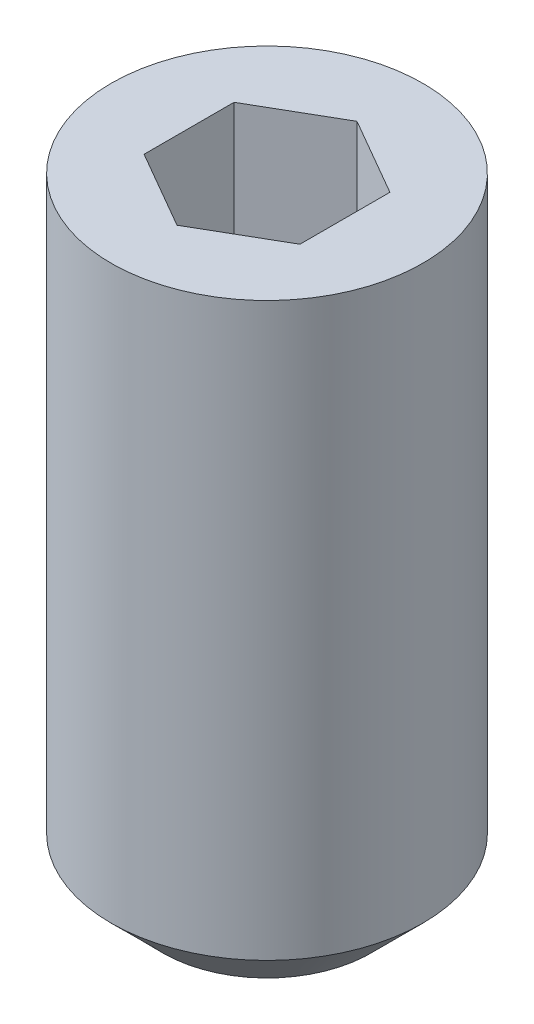
ISO-10303-21;
HEADER;
FILE_DESCRIPTION(('STEP AP214'),'2;1');
FILE_NAME('part.step','',(''),(''),'','','');
FILE_SCHEMA(('AUTOMOTIVE_DESIGN { 1 0 10303 214 1 1 1 1 }'));
ENDSEC;
DATA;
#1=APPLICATION_CONTEXT('core data for automotive mechanical design processes');
#2=APPLICATION_PROTOCOL_DEFINITION('international standard','automotive_design',2000,#1);
#3=PRODUCT_CONTEXT('',#1,'mechanical');
#4=PRODUCT('Part','Part','',(#3));
#5=PRODUCT_RELATED_PRODUCT_CATEGORY('part','',(#4));
#6=PRODUCT_DEFINITION_FORMATION('','',#4);
#7=PRODUCT_DEFINITION_CONTEXT('part definition',#1,'design');
#8=PRODUCT_DEFINITION('design','',#6,#7);
#9=PRODUCT_DEFINITION_SHAPE('','',#8);
#10=(LENGTH_UNIT() NAMED_UNIT(*) SI_UNIT(.MILLI.,.METRE.));
#11=(NAMED_UNIT(*) PLANE_ANGLE_UNIT() SI_UNIT($,.RADIAN.));
#12=(NAMED_UNIT(*) SI_UNIT($,.STERADIAN.) SOLID_ANGLE_UNIT());
#13=UNCERTAINTY_MEASURE_WITH_UNIT(LENGTH_MEASURE(1.E-05),#10,'distance_accuracy_value','');
#14=(GEOMETRIC_REPRESENTATION_CONTEXT(3) GLOBAL_UNCERTAINTY_ASSIGNED_CONTEXT((#13)) GLOBAL_UNIT_ASSIGNED_CONTEXT((#10,
#11,#12)) REPRESENTATION_CONTEXT('',''));
#15=CARTESIAN_POINT('',(0.,0.,0.));
#16=DIRECTION('',(0.,0.,1.));
#17=DIRECTION('',(1.,0.,0.));
#18=AXIS2_PLACEMENT_3D('',#15,#16,#17);
#19=CARTESIAN_POINT('',(0.,6.,0.));
#20=DIRECTION('',(0.,-1.,0.));
#21=DIRECTION('',(1.,0.,0.));
#22=AXIS2_PLACEMENT_3D('',#19,#20,#21);
#23=PLANE('',#22);
#24=CARTESIAN_POINT('',(0.,6.,0.));
#25=DIRECTION('',(0.,1.,0.));
#26=DIRECTION('',(-1.,0.,0.));
#27=AXIS2_PLACEMENT_3D('',#24,#25,#26);
#28=CIRCLE('',#27,1.5);
#29=CARTESIAN_POINT('',(-1.5,6.,0.));
#30=VERTEX_POINT('',#29);
#31=EDGE_CURVE('E11',#30,#30,#28,.T.);
#32=ORIENTED_EDGE('',*,*,#31,.T.);
#33=EDGE_LOOP('',(#32));
#34=FACE_BOUND('',#33,.T.);
#35=DIRECTION('',(-0.866025403784438,0.,0.5));
#36=VECTOR('',#35,1.);
#37=CARTESIAN_POINT('',(0.,6.,-0.866025403784438));
#38=LINE('',#37,#36);
#39=CARTESIAN_POINT('',(0.,6.,-0.866025403784439));
#40=VERTEX_POINT('',#39);
#41=CARTESIAN_POINT('',(-0.75,6.,-0.433012701892219));
#42=VERTEX_POINT('',#41);
#43=EDGE_CURVE('E150',#40,#42,#38,.T.);
#44=ORIENTED_EDGE('',*,*,#43,.F.);
#45=DIRECTION('',(-0.866025403784439,0.,-0.499999999999999));
#46=VECTOR('',#45,1.);
#47=CARTESIAN_POINT('',(0.75,6.,-0.43301270189222));
#48=LINE('',#47,#46);
#49=CARTESIAN_POINT('',(0.75,6.,-0.43301270189222));
#50=VERTEX_POINT('',#49);
#51=EDGE_CURVE('E50',#50,#40,#48,.T.);
#52=ORIENTED_EDGE('',*,*,#51,.F.);
#53=DIRECTION('',(0.,0.,-1.));
#54=VECTOR('',#53,1.);
#55=CARTESIAN_POINT('',(0.75,6.,0.433012701892219));
#56=LINE('',#55,#54);
#57=CARTESIAN_POINT('',(0.75,6.,0.433012701892219));
#58=VERTEX_POINT('',#57);
#59=EDGE_CURVE('E120',#58,#50,#56,.T.);
#60=ORIENTED_EDGE('',*,*,#59,.F.);
#61=DIRECTION('',(0.866025403784438,0.,-0.5));
#62=VECTOR('',#61,1.);
#63=CARTESIAN_POINT('',(0.,6.,0.866025403784438));
#64=LINE('',#63,#62);
#65=CARTESIAN_POINT('',(0.,6.,0.866025403784438));
#66=VERTEX_POINT('',#65);
#67=EDGE_CURVE('E158',#66,#58,#64,.T.);
#68=ORIENTED_EDGE('',*,*,#67,.F.);
#69=DIRECTION('',(0.866025403784439,0.,0.5));
#70=VECTOR('',#69,1.);
#71=CARTESIAN_POINT('',(-0.75,6.,0.433012701892219));
#72=LINE('',#71,#70);
#73=CARTESIAN_POINT('',(-0.75,6.,0.433012701892219));
#74=VERTEX_POINT('',#73);
#75=EDGE_CURVE('E155',#74,#66,#72,.T.);
#76=ORIENTED_EDGE('',*,*,#75,.F.);
#77=DIRECTION('',(0.,0.,1.));
#78=VECTOR('',#77,1.);
#79=CARTESIAN_POINT('',(-0.75,6.,-0.433012701892219));
#80=LINE('',#79,#78);
#81=EDGE_CURVE('E153',#42,#74,#80,.T.);
#82=ORIENTED_EDGE('',*,*,#81,.F.);
#83=EDGE_LOOP('',(#44,#52,#60,#68,#76,#82));
#84=FACE_BOUND('',#83,.T.);
#85=ADVANCED_FACE('F36',(#34,#84),#23,.F.);
#86=CARTESIAN_POINT('',(0.,6.,0.));
#87=DIRECTION('',(0.,1.,0.));
#88=DIRECTION('',(-1.,0.,0.));
#89=AXIS2_PLACEMENT_3D('',#86,#87,#88);
#90=CYLINDRICAL_SURFACE('',#89,1.5);
#91=CARTESIAN_POINT('',(0.,0.499999999999994,0.));
#92=DIRECTION('',(0.,-1.,0.));
#93=DIRECTION('',(0.,0.,-1.));
#94=AXIS2_PLACEMENT_3D('',#91,#92,#93);
#95=CIRCLE('',#94,1.5);
#96=CARTESIAN_POINT('',(0.,0.499999999999994,-1.5));
#97=VERTEX_POINT('',#96);
#98=EDGE_CURVE('E359',#97,#97,#95,.T.);
#99=ORIENTED_EDGE('',*,*,#98,.F.);
#100=EDGE_LOOP('',(#99));
#101=FACE_BOUND('',#100,.T.);
#102=ORIENTED_EDGE('',*,*,#31,.F.);
#103=EDGE_LOOP('',(#102));
#104=FACE_BOUND('',#103,.T.);
#105=ADVANCED_FACE('F219',(#101,#104),#90,.T.);
#106=CARTESIAN_POINT('',(0.75,4.8,-0.43301270189222));
#107=DIRECTION('',(0.499999999999999,0.,-0.866025403784439));
#108=DIRECTION('',(-0.866025403784439,0.,-0.499999999999999));
#109=AXIS2_PLACEMENT_3D('',#106,#107,#108);
#110=PLANE('',#109);
#111=DIRECTION('',(-0.866025403784439,0.,-0.499999999999999));
#112=VECTOR('',#111,1.);
#113=CARTESIAN_POINT('',(0.75,4.8,-0.43301270189222));
#114=LINE('',#113,#112);
#115=CARTESIAN_POINT('',(0.75,4.8,-0.43301270189222));
#116=VERTEX_POINT('',#115);
#117=CARTESIAN_POINT('',(0.374999999999999,4.8,-0.649519052838329));
#118=VERTEX_POINT('',#117);
#119=EDGE_CURVE('E119',#116,#118,#114,.T.);
#120=ORIENTED_EDGE('',*,*,#119,.F.);
#121=DIRECTION('',(0.,1.,0.));
#122=VECTOR('',#121,1.);
#123=CARTESIAN_POINT('',(0.75,4.8,-0.43301270189222));
#124=LINE('',#123,#122);
#125=EDGE_CURVE('E161',#116,#50,#124,.T.);
#126=ORIENTED_EDGE('',*,*,#125,.T.);
#127=ORIENTED_EDGE('',*,*,#51,.T.);
#128=DIRECTION('',(0.,1.,0.));
#129=VECTOR('',#128,1.);
#130=CARTESIAN_POINT('',(0.,4.8,-0.866025403784438));
#131=LINE('',#130,#129);
#132=CARTESIAN_POINT('',(0.,4.8,-0.866025403784438));
#133=VERTEX_POINT('',#132);
#134=EDGE_CURVE('E122',#133,#40,#131,.T.);
#135=ORIENTED_EDGE('',*,*,#134,.F.);
#136=EDGE_CURVE('E111',#118,#133,#114,.T.);
#137=ORIENTED_EDGE('',*,*,#136,.F.);
#138=EDGE_LOOP('',(#120,#126,#127,#135,#137));
#139=FACE_BOUND('',#138,.T.);
#140=ADVANCED_FACE('F123',(#139),#110,.F.);
#141=CARTESIAN_POINT('',(0.75,4.8,0.433012701892219));
#142=DIRECTION('',(1.,0.,0.));
#143=DIRECTION('',(0.,0.,-1.));
#144=AXIS2_PLACEMENT_3D('',#141,#142,#143);
#145=PLANE('',#144);
#146=DIRECTION('',(0.,0.,-1.));
#147=VECTOR('',#146,1.);
#148=CARTESIAN_POINT('',(0.75,4.8,0.433012701892219));
#149=LINE('',#148,#147);
#150=CARTESIAN_POINT('',(0.75,4.8,0.433012701892219));
#151=VERTEX_POINT('',#150);
#152=CARTESIAN_POINT('',(0.75,4.8,0.));
#153=VERTEX_POINT('',#152);
#154=EDGE_CURVE('E127',#151,#153,#149,.T.);
#155=ORIENTED_EDGE('',*,*,#154,.F.);
#156=DIRECTION('',(0.,1.,0.));
#157=VECTOR('',#156,1.);
#158=CARTESIAN_POINT('',(0.75,4.8,0.433012701892219));
#159=LINE('',#158,#157);
#160=EDGE_CURVE('E164',#151,#58,#159,.T.);
#161=ORIENTED_EDGE('',*,*,#160,.T.);
#162=ORIENTED_EDGE('',*,*,#59,.T.);
#163=ORIENTED_EDGE('',*,*,#125,.F.);
#164=EDGE_CURVE('E146',#153,#116,#149,.T.);
#165=ORIENTED_EDGE('',*,*,#164,.F.);
#166=EDGE_LOOP('',(#155,#161,#162,#163,#165));
#167=FACE_BOUND('',#166,.T.);
#168=ADVANCED_FACE('F192',(#167),#145,.F.);
#169=CARTESIAN_POINT('',(0.,4.8,0.866025403784438));
#170=DIRECTION('',(0.5,0.,0.866025403784438));
#171=DIRECTION('',(0.866025403784438,0.,-0.5));
#172=AXIS2_PLACEMENT_3D('',#169,#170,#171);
#173=PLANE('',#172);
#174=DIRECTION('',(0.866025403784438,0.,-0.5));
#175=VECTOR('',#174,1.);
#176=CARTESIAN_POINT('',(0.,4.8,0.866025403784438));
#177=LINE('',#176,#175);
#178=CARTESIAN_POINT('',(0.,4.8,0.866025403784438));
#179=VERTEX_POINT('',#178);
#180=CARTESIAN_POINT('',(0.375,4.8,0.649519052838329));
#181=VERTEX_POINT('',#180);
#182=EDGE_CURVE('E58',#179,#181,#177,.T.);
#183=ORIENTED_EDGE('',*,*,#182,.F.);
#184=DIRECTION('',(0.,1.,0.));
#185=VECTOR('',#184,1.);
#186=CARTESIAN_POINT('',(0.,4.8,0.866025403784438));
#187=LINE('',#186,#185);
#188=EDGE_CURVE('E167',#179,#66,#187,.T.);
#189=ORIENTED_EDGE('',*,*,#188,.T.);
#190=ORIENTED_EDGE('',*,*,#67,.T.);
#191=ORIENTED_EDGE('',*,*,#160,.F.);
#192=EDGE_CURVE('E144',#181,#151,#177,.T.);
#193=ORIENTED_EDGE('',*,*,#192,.F.);
#194=EDGE_LOOP('',(#183,#189,#190,#191,#193));
#195=FACE_BOUND('',#194,.T.);
#196=ADVANCED_FACE('F247',(#195),#173,.F.);
#197=CARTESIAN_POINT('',(-0.75,4.8,0.433012701892219));
#198=DIRECTION('',(-0.5,0.,0.866025403784439));
#199=DIRECTION('',(0.866025403784439,0.,0.5));
#200=AXIS2_PLACEMENT_3D('',#197,#198,#199);
#201=PLANE('',#200);
#202=DIRECTION('',(0.866025403784439,0.,0.5));
#203=VECTOR('',#202,1.);
#204=CARTESIAN_POINT('',(-0.75,4.8,0.433012701892219));
#205=LINE('',#204,#203);
#206=CARTESIAN_POINT('',(-0.75,4.8,0.433012701892219));
#207=VERTEX_POINT('',#206);
#208=CARTESIAN_POINT('',(-0.375,4.8,0.649519052838329));
#209=VERTEX_POINT('',#208);
#210=EDGE_CURVE('E141',#207,#209,#205,.T.);
#211=ORIENTED_EDGE('',*,*,#210,.F.);
#212=DIRECTION('',(0.,1.,0.));
#213=VECTOR('',#212,1.);
#214=CARTESIAN_POINT('',(-0.75,4.8,0.433012701892219));
#215=LINE('',#214,#213);
#216=EDGE_CURVE('E170',#207,#74,#215,.T.);
#217=ORIENTED_EDGE('',*,*,#216,.T.);
#218=ORIENTED_EDGE('',*,*,#75,.T.);
#219=ORIENTED_EDGE('',*,*,#188,.F.);
#220=EDGE_CURVE('E140',#209,#179,#205,.T.);
#221=ORIENTED_EDGE('',*,*,#220,.F.);
#222=EDGE_LOOP('',(#211,#217,#218,#219,#221));
#223=FACE_BOUND('',#222,.T.);
#224=ADVANCED_FACE('F244',(#223),#201,.F.);
#225=CARTESIAN_POINT('',(-0.750000000000001,4.8,-0.433012701892219));
#226=DIRECTION('',(-1.,0.,0.));
#227=DIRECTION('',(0.,0.,1.));
#228=AXIS2_PLACEMENT_3D('',#225,#226,#227);
#229=PLANE('',#228);
#230=DIRECTION('',(0.,0.,1.));
#231=VECTOR('',#230,1.);
#232=CARTESIAN_POINT('',(-0.750000000000001,4.8,-0.433012701892219));
#233=LINE('',#232,#231);
#234=CARTESIAN_POINT('',(-0.750000000000001,4.8,-0.433012701892219));
#235=VERTEX_POINT('',#234);
#236=CARTESIAN_POINT('',(-0.750000000000001,4.8,0.));
#237=VERTEX_POINT('',#236);
#238=EDGE_CURVE('E135',#235,#237,#233,.T.);
#239=ORIENTED_EDGE('',*,*,#238,.F.);
#240=DIRECTION('',(0.,1.,0.));
#241=VECTOR('',#240,1.);
#242=CARTESIAN_POINT('',(-0.750000000000001,4.8,-0.433012701892219));
#243=LINE('',#242,#241);
#244=EDGE_CURVE('E126',#235,#42,#243,.T.);
#245=ORIENTED_EDGE('',*,*,#244,.T.);
#246=ORIENTED_EDGE('',*,*,#81,.T.);
#247=ORIENTED_EDGE('',*,*,#216,.F.);
#248=EDGE_CURVE('E133',#237,#207,#233,.T.);
#249=ORIENTED_EDGE('',*,*,#248,.F.);
#250=EDGE_LOOP('',(#239,#245,#246,#247,#249));
#251=FACE_BOUND('',#250,.T.);
#252=ADVANCED_FACE('F202',(#251),#229,.F.);
#253=CARTESIAN_POINT('',(0.,4.8,-0.866025403784438));
#254=DIRECTION('',(-0.5,0.,-0.866025403784438));
#255=DIRECTION('',(-0.866025403784439,0.,0.5));
#256=AXIS2_PLACEMENT_3D('',#253,#254,#255);
#257=PLANE('',#256);
#258=DIRECTION('',(-0.866025403784438,0.,0.5));
#259=VECTOR('',#258,1.);
#260=CARTESIAN_POINT('',(0.,4.8,-0.866025403784438));
#261=LINE('',#260,#259);
#262=CARTESIAN_POINT('',(-0.375,4.8,-0.649519052838329));
#263=VERTEX_POINT('',#262);
#264=EDGE_CURVE('E114',#133,#263,#261,.T.);
#265=ORIENTED_EDGE('',*,*,#264,.F.);
#266=ORIENTED_EDGE('',*,*,#134,.T.);
#267=ORIENTED_EDGE('',*,*,#43,.T.);
#268=ORIENTED_EDGE('',*,*,#244,.F.);
#269=EDGE_CURVE('E132',#263,#235,#261,.T.);
#270=ORIENTED_EDGE('',*,*,#269,.F.);
#271=EDGE_LOOP('',(#265,#266,#267,#268,#270));
#272=FACE_BOUND('',#271,.T.);
#273=ADVANCED_FACE('F130',(#272),#257,.F.);
#274=CARTESIAN_POINT('',(0.,4.8,0.));
#275=DIRECTION('',(0.,1.,0.));
#276=DIRECTION('',(0.,0.,1.));
#277=AXIS2_PLACEMENT_3D('',#274,#275,#276);
#278=PLANE('',#277);
#279=ORIENTED_EDGE('',*,*,#192,.T.);
#280=ORIENTED_EDGE('',*,*,#154,.T.);
#281=CARTESIAN_POINT('',(0.,4.8,0.));
#282=DIRECTION('',(0.,1.,0.));
#283=DIRECTION('',(-1.,0.,0.));
#284=AXIS2_PLACEMENT_3D('',#281,#282,#283);
#285=CIRCLE('',#284,0.75);
#286=EDGE_CURVE('E179',#181,#153,#285,.T.);
#287=ORIENTED_EDGE('',*,*,#286,.F.);
#288=EDGE_LOOP('',(#279,#280,#287));
#289=FACE_BOUND('',#288,.T.);
#290=ADVANCED_FACE('F187',(#289),#278,.T.);
#291=ORIENTED_EDGE('',*,*,#164,.T.);
#292=ORIENTED_EDGE('',*,*,#119,.T.);
#293=EDGE_CURVE('E180',#153,#118,#285,.T.);
#294=ORIENTED_EDGE('',*,*,#293,.F.);
#295=EDGE_LOOP('',(#291,#292,#294));
#296=FACE_BOUND('',#295,.T.);
#297=ADVANCED_FACE('F196',(#296),#278,.T.);
#298=ORIENTED_EDGE('',*,*,#136,.T.);
#299=ORIENTED_EDGE('',*,*,#264,.T.);
#300=EDGE_CURVE('E116',#118,#263,#285,.T.);
#301=ORIENTED_EDGE('',*,*,#300,.F.);
#302=EDGE_LOOP('',(#298,#299,#301));
#303=FACE_BOUND('',#302,.T.);
#304=ADVANCED_FACE('F112',(#303),#278,.T.);
#305=ORIENTED_EDGE('',*,*,#269,.T.);
#306=ORIENTED_EDGE('',*,*,#238,.T.);
#307=EDGE_CURVE('E163',#263,#237,#285,.T.);
#308=ORIENTED_EDGE('',*,*,#307,.F.);
#309=EDGE_LOOP('',(#305,#306,#308));
#310=FACE_BOUND('',#309,.T.);
#311=ADVANCED_FACE('F206',(#310),#278,.T.);
#312=ORIENTED_EDGE('',*,*,#248,.T.);
#313=ORIENTED_EDGE('',*,*,#210,.T.);
#314=EDGE_CURVE('E43',#237,#209,#285,.T.);
#315=ORIENTED_EDGE('',*,*,#314,.F.);
#316=EDGE_LOOP('',(#312,#313,#315));
#317=FACE_BOUND('',#316,.T.);
#318=ADVANCED_FACE('F208',(#317),#278,.T.);
#319=ORIENTED_EDGE('',*,*,#220,.T.);
#320=ORIENTED_EDGE('',*,*,#182,.T.);
#321=EDGE_CURVE('E175',#209,#181,#285,.T.);
#322=ORIENTED_EDGE('',*,*,#321,.F.);
#323=EDGE_LOOP('',(#319,#320,#322));
#324=FACE_BOUND('',#323,.T.);
#325=ADVANCED_FACE('F214',(#324),#278,.T.);
#326=CARTESIAN_POINT('',(0.,4.36698729810778,0.));
#327=DIRECTION('',(0.,1.,0.));
#328=DIRECTION('',(-1.,0.,0.));
#329=AXIS2_PLACEMENT_3D('',#326,#327,#328);
#330=CONICAL_SURFACE('',#329,0.,1.0471975511966);
#331=ORIENTED_EDGE('',*,*,#314,.T.);
#332=ORIENTED_EDGE('',*,*,#321,.T.);
#333=ORIENTED_EDGE('',*,*,#286,.T.);
#334=ORIENTED_EDGE('',*,*,#293,.T.);
#335=ORIENTED_EDGE('',*,*,#300,.T.);
#336=ORIENTED_EDGE('',*,*,#307,.T.);
#337=EDGE_LOOP('',(#331,#332,#333,#334,#335,#336));
#338=FACE_BOUND('',#337,.T.);
#339=CARTESIAN_POINT('',(0.,4.36698729810778,0.));
#340=VERTEX_POINT('',#339);
#341=VERTEX_LOOP('',#340);
#342=FACE_BOUND('',#341,.T.);
#343=ADVANCED_FACE('F184',(#338,#342),#330,.F.);
#344=CARTESIAN_POINT('',(0.,0.499999999999994,0.));
#345=DIRECTION('',(0.,1.,0.));
#346=DIRECTION('',(0.,0.,1.));
#347=AXIS2_PLACEMENT_3D('',#344,#345,#346);
#348=CONICAL_SURFACE('',#347,1.5,0.785398163397454);
#349=CARTESIAN_POINT('',(0.,0.,0.));
#350=DIRECTION('',(0.,-1.,0.));
#351=DIRECTION('',(0.,0.,-1.));
#352=AXIS2_PLACEMENT_3D('',#349,#350,#351);
#353=CIRCLE('',#352,1.);
#354=CARTESIAN_POINT('',(0.,0.,-1.));
#355=VERTEX_POINT('',#354);
#356=EDGE_CURVE('E151',#355,#355,#353,.T.);
#357=ORIENTED_EDGE('',*,*,#356,.F.);
#358=EDGE_LOOP('',(#357));
#359=FACE_BOUND('',#358,.T.);
#360=ORIENTED_EDGE('',*,*,#98,.T.);
#361=EDGE_LOOP('',(#360));
#362=FACE_BOUND('',#361,.T.);
#363=ADVANCED_FACE('F236',(#359,#362),#348,.T.);
#364=CARTESIAN_POINT('',(1.5,0.,0.));
#365=DIRECTION('',(0.,1.,0.));
#366=DIRECTION('',(-1.,0.,0.));
#367=AXIS2_PLACEMENT_3D('',#364,#365,#366);
#368=PLANE('',#367);
#369=ORIENTED_EDGE('',*,*,#356,.T.);
#370=EDGE_LOOP('',(#369));
#371=FACE_BOUND('',#370,.T.);
#372=ADVANCED_FACE('F233',(#371),#368,.F.);
#373=CLOSED_SHELL('',(#85,#105,#140,#168,#196,#224,#252,#273,#290,#297,#304,#311,#318,#325,#343,
#363,#372));
#374=MANIFOLD_SOLID_BREP('B2',#373);
#375=ADVANCED_BREP_SHAPE_REPRESENTATION('',(#18,#374),#14);
#376=SHAPE_DEFINITION_REPRESENTATION(#9,#375);
ENDSEC;
END-ISO-10303-21;
